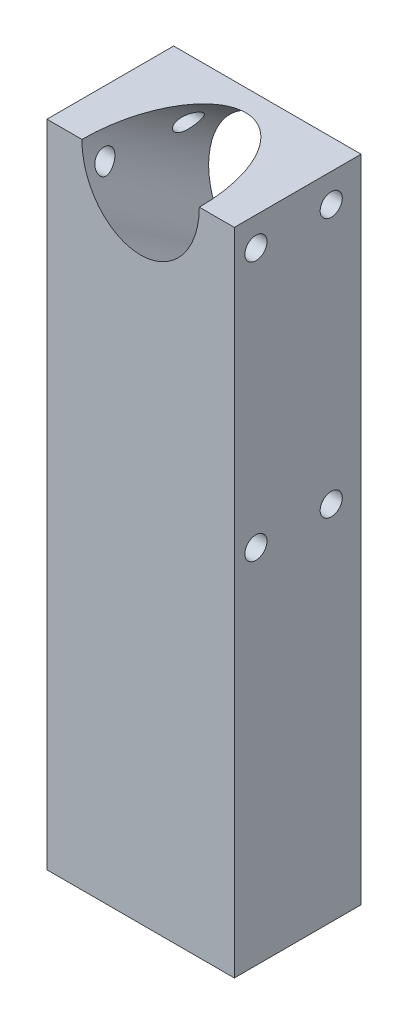
ISO-10303-21;
HEADER;
FILE_DESCRIPTION(('STEP AP214'),'2;1');
FILE_NAME('part.step','',(''),(''),'','','');
FILE_SCHEMA(('AUTOMOTIVE_DESIGN { 1 0 10303 214 1 1 1 1 }'));
ENDSEC;
DATA;
#1=APPLICATION_CONTEXT('core data for automotive mechanical design processes');
#2=APPLICATION_PROTOCOL_DEFINITION('international standard','automotive_design',2000,#1);
#3=PRODUCT_CONTEXT('',#1,'mechanical');
#4=PRODUCT('Part','Part','',(#3));
#5=PRODUCT_RELATED_PRODUCT_CATEGORY('part','',(#4));
#6=PRODUCT_DEFINITION_FORMATION('','',#4);
#7=PRODUCT_DEFINITION_CONTEXT('part definition',#1,'design');
#8=PRODUCT_DEFINITION('design','',#6,#7);
#9=PRODUCT_DEFINITION_SHAPE('','',#8);
#10=(LENGTH_UNIT() NAMED_UNIT(*) SI_UNIT(.MILLI.,.METRE.));
#11=(NAMED_UNIT(*) PLANE_ANGLE_UNIT() SI_UNIT($,.RADIAN.));
#12=(NAMED_UNIT(*) SI_UNIT($,.STERADIAN.) SOLID_ANGLE_UNIT());
#13=UNCERTAINTY_MEASURE_WITH_UNIT(LENGTH_MEASURE(1.E-05),#10,'distance_accuracy_value','');
#14=(GEOMETRIC_REPRESENTATION_CONTEXT(3) GLOBAL_UNCERTAINTY_ASSIGNED_CONTEXT((#13)) GLOBAL_UNIT_ASSIGNED_CONTEXT((#10,
#11,#12)) REPRESENTATION_CONTEXT('',''));
#15=CARTESIAN_POINT('',(0.,0.,0.));
#16=DIRECTION('',(0.,0.,1.));
#17=DIRECTION('',(1.,0.,0.));
#18=AXIS2_PLACEMENT_3D('',#15,#16,#17);
#19=CARTESIAN_POINT('',(4668.57723500689,-4158.71386991855,60.0243600791614));
#20=DIRECTION('',(-1.,0.,0.));
#21=DIRECTION('',(0.,-1.,0.));
#22=AXIS2_PLACEMENT_3D('',#19,#20,#21);
#23=CYLINDRICAL_SURFACE('',#22,1.50000000000003);
#24=CARTESIAN_POINT('',(4663.29315786128,-4160.21386991855,60.0243600791614));
#25=CARTESIAN_POINT('',(4663.31028719174,-4160.21387411275,60.1031487408246));
#26=CARTESIAN_POINT('',(4663.32506304882,-4160.20764481529,60.1824299364788));
#27=CARTESIAN_POINT('',(4663.34994490399,-4160.1825056904,60.3397065651558));
#28=CARTESIAN_POINT('',(4663.36005215826,-4160.16359927738,60.4177023385958));
#29=CARTESIAN_POINT('',(4663.3756656756,-4160.11335856765,60.5701433442805));
#30=CARTESIAN_POINT('',(4663.38116808386,-4160.0820138909,60.6445855527068));
#31=CARTESIAN_POINT('',(4663.38761349707,-4160.00767086502,60.7876262930087));
#32=CARTESIAN_POINT('',(4663.38855634154,-4159.96467210581,60.8562246191355));
#33=CARTESIAN_POINT('',(4663.38590779636,-4159.86880069808,60.9848263402098));
#34=CARTESIAN_POINT('',(4663.3823674096,-4159.81604484214,61.0449179212571));
#35=CARTESIAN_POINT('',(4663.37080248677,-4159.70192698736,61.1557618598083));
#36=CARTESIAN_POINT('',(4663.36277819203,-4159.64056545181,61.206514719733));
#37=CARTESIAN_POINT('',(4663.34216400121,-4159.51100360017,61.2974880819213));
#38=CARTESIAN_POINT('',(4663.32956582958,-4159.44279105135,61.3376892643287));
#39=CARTESIAN_POINT('',(4663.29976307705,-4159.30173704484,61.4065955251621));
#40=CARTESIAN_POINT('',(4663.28255834742,-4159.22889543775,61.4353002323326));
#41=CARTESIAN_POINT('',(4663.24314168455,-4159.07916486318,61.4813527591177));
#42=CARTESIAN_POINT('',(4663.22082849323,-4159.00222222398,61.498438534985));
#43=CARTESIAN_POINT('',(4663.17157264678,-4158.84809311233,61.5203708390608));
#44=CARTESIAN_POINT('',(4663.1446292026,-4158.77090660053,61.5252152789964));
#45=CARTESIAN_POINT('',(4663.08484892696,-4158.61427621958,61.5232057777095));
#46=CARTESIAN_POINT('',(4663.05177402552,-4158.534932295,61.5157125427155));
#47=CARTESIAN_POINT('',(4662.98131939799,-4158.38027545587,61.4889018740488));
#48=CARTESIAN_POINT('',(4662.94393810354,-4158.30496402464,61.4695801213933));
#49=CARTESIAN_POINT('',(4662.86172026783,-4158.15293012498,61.4180577031873));
#50=CARTESIAN_POINT('',(4662.81651246515,-4158.07676936152,61.3847965609525));
#51=CARTESIAN_POINT('',(4662.72261245592,-4157.93256788157,61.3074315111849));
#52=CARTESIAN_POINT('',(4662.67391886747,-4157.86453041432,61.2633232863856));
#53=CARTESIAN_POINT('',(4662.56746323326,-4157.7291555105,61.159498123354));
#54=CARTESIAN_POINT('',(4662.50934997602,-4157.66308300564,61.0984921573808));
#55=CARTESIAN_POINT('',(4662.39138076285,-4157.54338309913,60.9666463676426));
#56=CARTESIAN_POINT('',(4662.33152304497,-4157.48976880824,60.8957963083006));
#57=CARTESIAN_POINT('',(4662.20453069413,-4157.39014195012,60.736805704533));
#58=CARTESIAN_POINT('',(4662.13738589635,-4157.34581684875,60.647610499545));
#59=CARTESIAN_POINT('',(4662.00580643409,-4157.27518455155,60.4604582094007));
#60=CARTESIAN_POINT('',(4661.94137007927,-4157.24886595634,60.3625067120848));
#61=CARTESIAN_POINT('',(4661.83547742169,-4157.22075291915,60.1864881494571));
#62=CARTESIAN_POINT('',(4661.79247749999,-4157.21428817456,60.110090411247));
#63=CARTESIAN_POINT('',(4661.71228150217,-4157.21349228001,59.954242785364));
#64=CARTESIAN_POINT('',(4661.67507523506,-4157.21913956049,59.8747985704455));
#65=CARTESIAN_POINT('',(4661.61664024925,-4157.24125032114,59.7321552281871));
#66=CARTESIAN_POINT('',(4661.59369783937,-4157.25504328039,59.6692522049973));
#67=CARTESIAN_POINT('',(4661.55472513965,-4157.29143048025,59.5438210092993));
#68=CARTESIAN_POINT('',(4661.53868893202,-4157.31401715396,59.4812925613175));
#69=CARTESIAN_POINT('',(4661.51495547664,-4157.36831614317,59.357988432765));
#70=CARTESIAN_POINT('',(4661.5073241424,-4157.40009815622,59.2972301943452));
#71=CARTESIAN_POINT('',(4661.50154316927,-4157.47195713271,59.1803513650359));
#72=CARTESIAN_POINT('',(4661.50338885288,-4157.51202999473,59.1242285001956));
#73=CARTESIAN_POINT('',(4661.51553129282,-4157.59364583059,59.0249963358927));
#74=CARTESIAN_POINT('',(4661.52479122837,-4157.63444017873,58.9811333893438));
#75=CARTESIAN_POINT('',(4661.54963656994,-4157.71990021469,58.8994044078222));
#76=CARTESIAN_POINT('',(4661.56522498592,-4157.76456773672,58.8615412384087));
#77=CARTESIAN_POINT('',(4661.60770951554,-4157.87192866372,58.780559803507));
#78=CARTESIAN_POINT('',(4661.63664292496,-4157.93566622948,58.7398992536019));
#79=CARTESIAN_POINT('',(4661.70120056098,-4158.06577408931,58.6695653698272));
#80=CARTESIAN_POINT('',(4661.73683875451,-4158.1321496468,58.639915362846));
#81=CARTESIAN_POINT('',(4661.82517205423,-4158.28828176302,58.5828736903555));
#82=CARTESIAN_POINT('',(4661.87960900457,-4158.37850702956,58.5594761369551));
#83=CARTESIAN_POINT('',(4661.99274345251,-4158.55900004624,58.529569738906));
#84=CARTESIAN_POINT('',(4662.05144437147,-4158.64926777143,58.523074613955));
#85=CARTESIAN_POINT('',(4662.17166100098,-4158.83005841277,58.526088688372));
#86=CARTESIAN_POINT('',(4662.23320879251,-4158.92055467809,58.5358986953132));
#87=CARTESIAN_POINT('',(4662.35600275905,-4159.09850281149,58.5716748440403));
#88=CARTESIAN_POINT('',(4662.41724891198,-4159.1859544595,58.5976421511628));
#89=CARTESIAN_POINT('',(4662.54473619966,-4159.36584852002,58.6696046475364));
#90=CARTESIAN_POINT('',(4662.61073017798,-4159.45768905166,58.7175773641827));
#91=CARTESIAN_POINT('',(4662.73794748217,-4159.63176059932,58.8333997125395));
#92=CARTESIAN_POINT('',(4662.79917177044,-4159.71399355555,58.9012453212524));
#93=CARTESIAN_POINT('',(4662.91004170144,-4159.85828375575,59.0496102490833));
#94=CARTESIAN_POINT('',(4662.96022377864,-4159.92143676594,59.1286541805647));
#95=CARTESIAN_POINT('',(4663.05328065769,-4160.03183087088,59.3008966136189));
#96=CARTESIAN_POINT('',(4663.09616517179,-4160.07909319751,59.3940759848536));
#97=CARTESIAN_POINT('',(4663.16740503331,-4160.14790799509,59.5755660604496));
#98=CARTESIAN_POINT('',(4663.1969859533,-4160.17234877649,59.6623061136876));
#99=CARTESIAN_POINT('',(4663.24983489824,-4160.20532022762,59.8405954407421));
#100=CARTESIAN_POINT('',(4663.27310850695,-4160.21386500936,59.9321403746036));
#101=CARTESIAN_POINT('',(4663.29315786128,-4160.21386991855,60.0243600791614));
#102=B_SPLINE_CURVE_WITH_KNOTS('',3,(#24,#25,#26,#27,#28,#29,#30,#31,#32,#33,#34,#35,#36,#37,
#38,#39,#40,#41,#42,#43,#44,#45,#46,#47,#48,#49,#50,#51,#52,#53,#54,#55,#56,#57,#58,#59,#60,#61,
#62,#63,#64,#65,#66,#67,#68,#69,#70,#71,#72,#73,#74,#75,#76,#77,#78,#79,#80,#81,#82,#83,#84,#85,
#86,#87,#88,#89,#90,#91,#92,#93,#94,#95,#96,#97,#98,#99,#100,#101),.UNSPECIFIED.,.T.,.F.,(4,2,2,
2,2,2,2,2,2,2,2,2,2,2,2,2,2,2,2,2,2,2,2,2,2,2,2,2,2,2,2,2,2,2,2,2,2,2,4),(0.,0.241569452500045,
0.483073867626929,0.724780249661558,0.966495138069742,1.20548473034888,1.44446146128622,
1.68387274748376,1.92329176436355,2.16794572181017,2.41264141242336,2.67041959711651,
2.92829196133203,3.21098114093499,3.49378301677459,3.81371788807291,4.13398794224667,
4.49274065802378,4.85126604764086,5.11411376617653,5.37649378422738,5.58080264594752,
5.78493608925321,5.9906592537358,6.19628089074422,6.37731777505938,6.55844086563602,
6.79996002247902,7.04198798040022,7.36410636360063,7.68648612879252,8.01487962144012,
8.34329680203968,8.70989740749398,9.07642385085305,9.41320464886638,9.74953366169454,
10.0325346341052,10.3152842464159),.UNSPECIFIED.);
#103=CARTESIAN_POINT('',(4663.29315786128,-4160.21386991855,60.0243600791614));
#104=VERTEX_POINT('',#103);
#105=EDGE_CURVE('E96',#104,#104,#102,.T.);
#106=ORIENTED_EDGE('',*,*,#105,.T.);
#107=EDGE_LOOP('',(#106));
#108=FACE_BOUND('',#107,.T.);
#109=CARTESIAN_POINT('',(4668.57723500689,-4158.71386991855,60.0243600791614));
#110=DIRECTION('',(-1.,0.,0.));
#111=DIRECTION('',(0.,-1.,0.));
#112=AXIS2_PLACEMENT_3D('',#109,#110,#111);
#113=CIRCLE('',#112,1.50000000000003);
#114=CARTESIAN_POINT('',(4668.57723500689,-4160.21386991855,60.0243600791614));
#115=VERTEX_POINT('',#114);
#116=EDGE_CURVE('E205',#115,#115,#113,.T.);
#117=ORIENTED_EDGE('',*,*,#116,.F.);
#118=EDGE_LOOP('',(#117));
#119=FACE_BOUND('',#118,.T.);
#120=ADVANCED_FACE('F37',(#108,#119),#23,.F.);
#121=CARTESIAN_POINT('',(4668.57723500689,-4158.71386991855,70.2295511072476));
#122=DIRECTION('',(-1.,0.,0.));
#123=DIRECTION('',(0.,-1.,0.));
#124=AXIS2_PLACEMENT_3D('',#121,#122,#123);
#125=CYLINDRICAL_SURFACE('',#124,1.50000000000018);
#126=CARTESIAN_POINT('',(4663.31582890784,-4160.21386991855,70.2295511072476));
#127=CARTESIAN_POINT('',(4663.29897266305,-4160.21386887635,70.3089602902174));
#128=CARTESIAN_POINT('',(4663.28357963159,-4160.20755218165,70.3886987717001));
#129=CARTESIAN_POINT('',(4663.25679198467,-4160.18211709359,70.5468213301461));
#130=CARTESIAN_POINT('',(4663.24539745555,-4160.16299842386,70.6252053778328));
#131=CARTESIAN_POINT('',(4663.22748375802,-4160.11212116538,70.7785812121746));
#132=CARTESIAN_POINT('',(4663.22097621388,-4160.08033271297,70.8535645145697));
#133=CARTESIAN_POINT('',(4663.21344988861,-4160.00488345221,70.9975935778545));
#134=CARTESIAN_POINT('',(4663.2124298045,-4159.9612254648,71.0666407444218));
#135=CARTESIAN_POINT('',(4663.21589973715,-4159.86517634982,71.1942465345016));
#136=CARTESIAN_POINT('',(4663.22018871885,-4159.81316494462,71.2530972763099));
#137=CARTESIAN_POINT('',(4663.23358326394,-4159.70093900387,71.3617147505162));
#138=CARTESIAN_POINT('',(4663.24268916789,-4159.64072388853,71.4114808402707));
#139=CARTESIAN_POINT('',(4663.26511493417,-4159.51330702239,71.501173820485));
#140=CARTESIAN_POINT('',(4663.2784701894,-4159.44604989484,71.5410128707813));
#141=CARTESIAN_POINT('',(4663.30843888191,-4159.30677749814,71.6095839046558));
#142=CARTESIAN_POINT('',(4663.3250531754,-4159.23476098193,71.6383129635785));
#143=CARTESIAN_POINT('',(4663.36165914894,-4159.0829774076,71.6857371882641));
#144=CARTESIAN_POINT('',(4663.38179880012,-4159.00300914353,71.7036739275888));
#145=CARTESIAN_POINT('',(4663.42340476494,-4158.84155421446,71.7263301963387));
#146=CARTESIAN_POINT('',(4663.44487151723,-4158.7600670537,71.7310453314181));
#147=CARTESIAN_POINT('',(4663.4892666937,-4158.59264459349,71.7271222974521));
#148=CARTESIAN_POINT('',(4663.51220672053,-4158.50673007753,71.7176810375404));
#149=CARTESIAN_POINT('',(4663.55709001462,-4158.33753307783,71.6841333548829));
#150=CARTESIAN_POINT('',(4663.57903320099,-4158.25425080785,71.6600257443661));
#151=CARTESIAN_POINT('',(4663.62106768523,-4158.09200903868,71.5973619145579));
#152=CARTESIAN_POINT('',(4663.64114345464,-4158.0130876805,71.5586960766278));
#153=CARTESIAN_POINT('',(4663.67845387479,-4157.86273216349,71.4678064450524));
#154=CARTESIAN_POINT('',(4663.69568913017,-4157.79129641244,71.4155855428675));
#155=CARTESIAN_POINT('',(4663.7263219255,-4157.66054127453,71.3009088229385));
#156=CARTESIAN_POINT('',(4663.73982820058,-4157.60089748702,71.238851996271));
#157=CARTESIAN_POINT('',(4663.76361943188,-4157.49286846675,71.10507538609));
#158=CARTESIAN_POINT('',(4663.77390496105,-4157.44448123193,71.033357324492));
#159=CARTESIAN_POINT('',(4663.7911694451,-4157.36192134755,70.8847163936895));
#160=CARTESIAN_POINT('',(4663.79824018931,-4157.32735803451,70.8080208032795));
#161=CARTESIAN_POINT('',(4663.80992250689,-4157.27149088297,70.6497686320246));
#162=CARTESIAN_POINT('',(4663.81453417752,-4157.25018652005,70.568212243577));
#163=CARTESIAN_POINT('',(4663.82180858714,-4157.22161629352,70.403175661094));
#164=CARTESIAN_POINT('',(4663.82448448275,-4157.21425509936,70.3197125088013));
#165=CARTESIAN_POINT('',(4663.82851166715,-4157.2135142314,70.1526923804775));
#166=CARTESIAN_POINT('',(4663.82986292366,-4157.22013489822,70.0691354022102));
#167=CARTESIAN_POINT('',(4663.83177530751,-4157.2472567889,69.9038196687059));
#168=CARTESIAN_POINT('',(4663.83233201131,-4157.2678347893,69.8220734561945));
#169=CARTESIAN_POINT('',(4663.83305545434,-4157.32237070132,69.663171051767));
#170=CARTESIAN_POINT('',(4663.8332221868,-4157.35632884543,69.5860149396334));
#171=CARTESIAN_POINT('',(4663.8333966496,-4157.43681199519,69.438204626434));
#172=CARTESIAN_POINT('',(4663.83340381403,-4157.48338113425,69.3675744503474));
#173=CARTESIAN_POINT('',(4663.83327183623,-4157.5877114663,69.2351296919371));
#174=CARTESIAN_POINT('',(4663.83313269231,-4157.64547278892,69.1733152117239));
#175=CARTESIAN_POINT('',(4663.83250062618,-4157.77057461585,69.060232339569));
#176=CARTESIAN_POINT('',(4663.83200755685,-4157.83791909477,69.0089683451162));
#177=CARTESIAN_POINT('',(4663.83026771739,-4157.98025265421,68.9184761970757));
#178=CARTESIAN_POINT('',(4663.82902094653,-4158.05524174235,68.8792480554772));
#179=CARTESIAN_POINT('',(4663.82524161168,-4158.21062585976,68.8139812552972));
#180=CARTESIAN_POINT('',(4663.82271052407,-4158.29101459003,68.7879275206013));
#181=CARTESIAN_POINT('',(4663.81577663449,-4158.45494469187,68.7496724647901));
#182=CARTESIAN_POINT('',(4663.81137392908,-4158.53848590059,68.7374704290415));
#183=CARTESIAN_POINT('',(4663.80017901499,-4158.70583571312,68.7272440439995));
#184=CARTESIAN_POINT('',(4663.79339932965,-4158.78964067737,68.729146422482));
#185=CARTESIAN_POINT('',(4663.77704097871,-4158.95549644337,68.7467932144103));
#186=CARTESIAN_POINT('',(4663.76746246317,-4159.03754733892,68.7625368858323));
#187=CARTESIAN_POINT('',(4663.74534809116,-4159.19728224142,68.8071698538182));
#188=CARTESIAN_POINT('',(4663.7328216563,-4159.27497920387,68.8360175374805));
#189=CARTESIAN_POINT('',(4663.70486162669,-4159.42415626021,68.9058152461292));
#190=CARTESIAN_POINT('',(4663.68942790349,-4159.4956360792,68.9467658059218));
#191=CARTESIAN_POINT('',(4663.65573391097,-4159.6315644439,69.0401238557036));
#192=CARTESIAN_POINT('',(4663.63743475831,-4159.6958916016,69.0926938028603));
#193=CARTESIAN_POINT('',(4663.59878058259,-4159.8147266998,69.2073305285199));
#194=CARTESIAN_POINT('',(4663.57842493687,-4159.86923165236,69.2694001862703));
#195=CARTESIAN_POINT('',(4663.53572980572,-4159.96893351534,69.4036845884499));
#196=CARTESIAN_POINT('',(4663.51334555872,-4160.01373158234,69.4761811373604));
#197=CARTESIAN_POINT('',(4663.46834822943,-4160.09041769962,69.6276231451126));
#198=CARTESIAN_POINT('',(4663.44573520894,-4160.12230914563,69.7065669011144));
#199=CARTESIAN_POINT('',(4663.40427576523,-4160.16925013585,69.8588640111056));
#200=CARTESIAN_POINT('',(4663.38531004223,-4160.18589800619,69.931696276527));
#201=CARTESIAN_POINT('',(4663.34906860261,-4160.20820738666,70.0794378693634));
#202=CARTESIAN_POINT('',(4663.33179257754,-4160.21387090556,70.1543468144609));
#203=CARTESIAN_POINT('',(4663.31582890784,-4160.21386991855,70.2295511072476));
#204=B_SPLINE_CURVE_WITH_KNOTS('',3,(#126,#127,#128,#129,#130,#131,#132,#133,#134,#135,#136,
#137,#138,#139,#140,#141,#142,#143,#144,#145,#146,#147,#148,#149,#150,#151,#152,#153,#154,#155,
#156,#157,#158,#159,#160,#161,#162,#163,#164,#165,#166,#167,#168,#169,#170,#171,#172,#173,#174,
#175,#176,#177,#178,#179,#180,#181,#182,#183,#184,#185,#186,#187,#188,#189,#190,#191,#192,#193,
#194,#195,#196,#197,#198,#199,#200,#201,#202,#203),.UNSPECIFIED.,.T.,.F.,(4,2,2,2,2,2,2,2,2,2,2,
2,2,2,2,2,2,2,2,2,2,2,2,2,2,2,2,2,2,2,2,2,2,2,2,2,2,2,4),(0.,0.243287299965945,0.48657985209316,
0.730449287195625,0.974260814007865,1.20911601119766,1.44398781548621,1.68086946503761,
1.91781343024405,2.16989731756686,2.42206497781985,2.68908936459405,2.95613537951956,
3.22523373520511,3.4942747360403,3.75435154819978,4.01438206821859,4.26643242153284,
4.51847280495035,4.76878365914063,5.01910061154974,5.27080579656652,5.52251535530674,
5.77511744160564,6.02772245351135,6.28043254001487,6.53314287824732,6.78556336956202,
7.0379708374721,7.28906797458252,7.54015165133963,7.79044350522353,8.0407464207442,
8.2947994042752,8.54892954123896,8.81207586033833,9.07515290047785,9.3055997522212,
9.53600445673619),.UNSPECIFIED.);
#205=CARTESIAN_POINT('',(4663.31582890784,-4160.21386991855,70.2295511072476));
#206=VERTEX_POINT('',#205);
#207=EDGE_CURVE('E41',#206,#206,#204,.T.);
#208=ORIENTED_EDGE('',*,*,#207,.T.);
#209=EDGE_LOOP('',(#208));
#210=FACE_BOUND('',#209,.T.);
#211=CARTESIAN_POINT('',(4668.57723500689,-4158.71386991855,70.2295511072476));
#212=DIRECTION('',(-1.,0.,0.));
#213=DIRECTION('',(0.,-1.,0.));
#214=AXIS2_PLACEMENT_3D('',#211,#212,#213);
#215=CIRCLE('',#214,1.50000000000018);
#216=CARTESIAN_POINT('',(4668.57723500689,-4160.21386991855,70.2295511072476));
#217=VERTEX_POINT('',#216);
#218=EDGE_CURVE('E213',#217,#217,#215,.T.);
#219=ORIENTED_EDGE('',*,*,#218,.F.);
#220=EDGE_LOOP('',(#219));
#221=FACE_BOUND('',#220,.T.);
#222=ADVANCED_FACE('F173',(#210,#221),#125,.F.);
#223=CARTESIAN_POINT('',(4685.67168100906,-4193.87686785341,60.0243600791614));
#224=DIRECTION('',(-1.,0.,0.));
#225=DIRECTION('',(0.,-1.,0.));
#226=AXIS2_PLACEMENT_3D('',#223,#224,#225);
#227=CYLINDRICAL_SURFACE('',#226,1.50000000000002);
#228=CARTESIAN_POINT('',(4668.57723500689,-4193.87686785341,60.0243600791614));
#229=DIRECTION('',(-1.,0.,0.));
#230=DIRECTION('',(0.,-1.,0.));
#231=AXIS2_PLACEMENT_3D('',#228,#229,#230);
#232=CIRCLE('',#231,1.50000000000002);
#233=CARTESIAN_POINT('',(4668.57723500689,-4195.37686785341,60.0243600791614));
#234=VERTEX_POINT('',#233);
#235=EDGE_CURVE('E119',#234,#234,#232,.T.);
#236=ORIENTED_EDGE('',*,*,#235,.F.);
#237=EDGE_LOOP('',(#236));
#238=FACE_BOUND('',#237,.T.);
#239=CARTESIAN_POINT('',(4643.17723500689,-4193.87686785341,60.0243600791614));
#240=DIRECTION('',(1.,0.,0.));
#241=DIRECTION('',(0.,1.,0.));
#242=AXIS2_PLACEMENT_3D('',#239,#240,#241);
#243=CIRCLE('',#242,1.50000000000008);
#244=CARTESIAN_POINT('',(4643.17723500689,-4192.37686785341,60.0243600791614));
#245=VERTEX_POINT('',#244);
#246=EDGE_CURVE('E132',#245,#245,#243,.T.);
#247=ORIENTED_EDGE('',*,*,#246,.F.);
#248=EDGE_LOOP('',(#247));
#249=FACE_BOUND('',#248,.T.);
#250=ADVANCED_FACE('F169',(#238,#249),#227,.F.);
#251=CARTESIAN_POINT('',(4685.67168100906,-4193.87686785341,70.2295511072476));
#252=DIRECTION('',(-1.,0.,0.));
#253=DIRECTION('',(0.,-1.,0.));
#254=AXIS2_PLACEMENT_3D('',#251,#252,#253);
#255=CYLINDRICAL_SURFACE('',#254,1.49999999999989);
#256=CARTESIAN_POINT('',(4668.57723500689,-4193.87686785341,70.2295511072476));
#257=DIRECTION('',(-1.,0.,0.));
#258=DIRECTION('',(0.,-1.,0.));
#259=AXIS2_PLACEMENT_3D('',#256,#257,#258);
#260=CIRCLE('',#259,1.49999999999989);
#261=CARTESIAN_POINT('',(4668.57723500689,-4195.37686785341,70.2295511072476));
#262=VERTEX_POINT('',#261);
#263=EDGE_CURVE('E126',#262,#262,#260,.T.);
#264=ORIENTED_EDGE('',*,*,#263,.F.);
#265=EDGE_LOOP('',(#264));
#266=FACE_BOUND('',#265,.T.);
#267=CARTESIAN_POINT('',(4643.17723500689,-4193.87686785341,70.2295511072476));
#268=DIRECTION('',(1.,0.,0.));
#269=DIRECTION('',(0.,1.,0.));
#270=AXIS2_PLACEMENT_3D('',#267,#268,#269);
#271=CIRCLE('',#270,1.49999999999993);
#272=CARTESIAN_POINT('',(4643.17723500689,-4192.37686785341,70.2295511072476));
#273=VERTEX_POINT('',#272);
#274=EDGE_CURVE('E129',#273,#273,#271,.T.);
#275=ORIENTED_EDGE('',*,*,#274,.F.);
#276=EDGE_LOOP('',(#275));
#277=FACE_BOUND('',#276,.T.);
#278=ADVANCED_FACE('F172',(#266,#277),#255,.F.);
#279=CARTESIAN_POINT('',(4594.68472853508,-4154.83236888598,27.7485333618744));
#280=DIRECTION('',(0.,-1.,0.));
#281=DIRECTION('',(0.,0.,1.));
#282=AXIS2_PLACEMENT_3D('',#279,#280,#281);
#283=PLANE('',#282);
#284=DIRECTION('',(-1.,0.,0.));
#285=VECTOR('',#284,1.);
#286=CARTESIAN_POINT('',(4668.57723500689,-4154.83236888598,73.1581251567649));
#287=LINE('',#286,#285);
#288=CARTESIAN_POINT('',(4647.92068500689,-4154.83236888598,73.1581251567649));
#289=VERTEX_POINT('',#288);
#290=CARTESIAN_POINT('',(4643.17723500689,-4154.83236888598,73.1581251567649));
#291=VERTEX_POINT('',#290);
#292=EDGE_CURVE('E103',#289,#291,#287,.T.);
#293=ORIENTED_EDGE('',*,*,#292,.F.);
#294=CARTESIAN_POINT('',(4655.87723500689,-4154.83236888598,73.1581251567642));
#295=DIRECTION('',(0.,-1.,0.));
#296=DIRECTION('',(0.,0.,1.));
#297=AXIS2_PLACEMENT_3D('',#294,#295,#296);
#298=ELLIPSE('',#297,14.2286319275809,7.95655000000049);
#299=CARTESIAN_POINT('',(4663.83378500689,-4154.83236888598,73.1581251567649));
#300=VERTEX_POINT('',#299);
#301=EDGE_CURVE('E58',#289,#300,#298,.T.);
#302=ORIENTED_EDGE('',*,*,#301,.T.);
#303=CARTESIAN_POINT('',(4668.57723500689,-4154.83236888598,73.1581251567649));
#304=VERTEX_POINT('',#303);
#305=EDGE_CURVE('E101',#304,#300,#287,.T.);
#306=ORIENTED_EDGE('',*,*,#305,.F.);
#307=DIRECTION('',(0.,0.,1.));
#308=VECTOR('',#307,1.);
#309=CARTESIAN_POINT('',(4668.57723500689,-4154.83236888598,55.9775327188838));
#310=LINE('',#309,#308);
#311=CARTESIAN_POINT('',(4668.57723500689,-4154.83236888598,55.9775327188837));
#312=VERTEX_POINT('',#311);
#313=EDGE_CURVE('E111',#312,#304,#310,.T.);
#314=ORIENTED_EDGE('',*,*,#313,.F.);
#315=DIRECTION('',(1.,0.,0.));
#316=VECTOR('',#315,1.);
#317=CARTESIAN_POINT('',(4668.57723500689,-4154.83236888598,55.9775327188838));
#318=LINE('',#317,#316);
#319=CARTESIAN_POINT('',(4643.17723500689,-4154.83236888598,55.9775327188837));
#320=VERTEX_POINT('',#319);
#321=EDGE_CURVE('E51',#320,#312,#318,.T.);
#322=ORIENTED_EDGE('',*,*,#321,.F.);
#323=DIRECTION('',(0.,0.,-1.));
#324=VECTOR('',#323,1.);
#325=CARTESIAN_POINT('',(4643.17723500689,-4154.83236888598,55.9775327188838));
#326=LINE('',#325,#324);
#327=EDGE_CURVE('E107',#291,#320,#326,.T.);
#328=ORIENTED_EDGE('',*,*,#327,.F.);
#329=EDGE_LOOP('',(#293,#302,#306,#314,#322,#328));
#330=FACE_BOUND('',#329,.T.);
#331=ADVANCED_FACE('F99',(#330),#283,.F.);
#332=CARTESIAN_POINT('',(4668.57723500689,-4124.1675232722,55.9775327188838));
#333=DIRECTION('',(-1.,0.,0.));
#334=DIRECTION('',(0.,-1.,0.));
#335=AXIS2_PLACEMENT_3D('',#332,#333,#334);
#336=PLANE('',#335);
#337=ORIENTED_EDGE('',*,*,#218,.T.);
#338=EDGE_LOOP('',(#337));
#339=FACE_BOUND('',#338,.T.);
#340=ORIENTED_EDGE('',*,*,#116,.T.);
#341=EDGE_LOOP('',(#340));
#342=FACE_BOUND('',#341,.T.);
#343=DIRECTION('',(0.,-1.,0.));
#344=VECTOR('',#343,1.);
#345=CARTESIAN_POINT('',(4668.57723500689,-4124.1675232722,73.1581251567649));
#346=LINE('',#345,#344);
#347=CARTESIAN_POINT('',(4668.57723500689,-4242.94201249301,73.1581251567649));
#348=VERTEX_POINT('',#347);
#349=EDGE_CURVE('E66',#304,#348,#346,.T.);
#350=ORIENTED_EDGE('',*,*,#349,.T.);
#351=DIRECTION('',(0.,0.,-1.));
#352=VECTOR('',#351,1.);
#353=CARTESIAN_POINT('',(4668.57723500689,-4242.94201249301,55.9775327188838));
#354=LINE('',#353,#352);
#355=CARTESIAN_POINT('',(4668.57723500689,-4242.94201249301,55.9775327188837));
#356=VERTEX_POINT('',#355);
#357=EDGE_CURVE('E207',#348,#356,#354,.T.);
#358=ORIENTED_EDGE('',*,*,#357,.T.);
#359=DIRECTION('',(0.,-1.,0.));
#360=VECTOR('',#359,1.);
#361=CARTESIAN_POINT('',(4668.57723500689,-4124.1675232722,55.9775327188838));
#362=LINE('',#361,#360);
#363=EDGE_CURVE('E117',#312,#356,#362,.T.);
#364=ORIENTED_EDGE('',*,*,#363,.F.);
#365=ORIENTED_EDGE('',*,*,#313,.T.);
#366=EDGE_LOOP('',(#350,#358,#364,#365));
#367=FACE_BOUND('',#366,.T.);
#368=ORIENTED_EDGE('',*,*,#235,.T.);
#369=EDGE_LOOP('',(#368));
#370=FACE_BOUND('',#369,.T.);
#371=ORIENTED_EDGE('',*,*,#263,.T.);
#372=EDGE_LOOP('',(#371));
#373=FACE_BOUND('',#372,.T.);
#374=ADVANCED_FACE('F180',(#339,#342,#367,#370,#373),#336,.F.);
#375=CARTESIAN_POINT('',(4643.17723500689,-4124.1675232722,55.9775327188838));
#376=DIRECTION('',(1.,0.,0.));
#377=DIRECTION('',(0.,1.,0.));
#378=AXIS2_PLACEMENT_3D('',#375,#376,#377);
#379=PLANE('',#378);
#380=CARTESIAN_POINT('',(4643.17723500689,-4158.71386991855,70.2295511072476));
#381=DIRECTION('',(-1.,0.,0.));
#382=DIRECTION('',(0.,-1.,0.));
#383=AXIS2_PLACEMENT_3D('',#380,#381,#382);
#384=CIRCLE('',#383,1.50000000000018);
#385=CARTESIAN_POINT('',(4643.17723500689,-4160.21386991855,70.2295511072476));
#386=VERTEX_POINT('',#385);
#387=EDGE_CURVE('E216',#386,#386,#384,.T.);
#388=ORIENTED_EDGE('',*,*,#387,.F.);
#389=EDGE_LOOP('',(#388));
#390=FACE_BOUND('',#389,.T.);
#391=CARTESIAN_POINT('',(4643.17723500689,-4158.71386991855,60.0243600791614));
#392=DIRECTION('',(-1.,0.,0.));
#393=DIRECTION('',(0.,-1.,0.));
#394=AXIS2_PLACEMENT_3D('',#391,#392,#393);
#395=CIRCLE('',#394,1.50000000000003);
#396=CARTESIAN_POINT('',(4643.17723500689,-4160.21386991855,60.0243600791614));
#397=VERTEX_POINT('',#396);
#398=EDGE_CURVE('E208',#397,#397,#395,.T.);
#399=ORIENTED_EDGE('',*,*,#398,.F.);
#400=EDGE_LOOP('',(#399));
#401=FACE_BOUND('',#400,.T.);
#402=DIRECTION('',(0.,-1.,0.));
#403=VECTOR('',#402,1.);
#404=CARTESIAN_POINT('',(4643.17723500689,-4124.1675232722,55.9775327188838));
#405=LINE('',#404,#403);
#406=CARTESIAN_POINT('',(4643.17723500689,-4242.94201249301,55.9775327188837));
#407=VERTEX_POINT('',#406);
#408=EDGE_CURVE('E123',#320,#407,#405,.T.);
#409=ORIENTED_EDGE('',*,*,#408,.T.);
#410=DIRECTION('',(0.,0.,1.));
#411=VECTOR('',#410,1.);
#412=CARTESIAN_POINT('',(4643.17723500689,-4242.94201249301,55.9775327188838));
#413=LINE('',#412,#411);
#414=CARTESIAN_POINT('',(4643.17723500689,-4242.94201249301,73.158125156767));
#415=VERTEX_POINT('',#414);
#416=EDGE_CURVE('E113',#407,#415,#413,.T.);
#417=ORIENTED_EDGE('',*,*,#416,.T.);
#418=DIRECTION('',(0.,-1.,0.));
#419=VECTOR('',#418,1.);
#420=CARTESIAN_POINT('',(4643.17723500689,-4124.1675232722,73.1581251567649));
#421=LINE('',#420,#419);
#422=EDGE_CURVE('E121',#291,#415,#421,.T.);
#423=ORIENTED_EDGE('',*,*,#422,.F.);
#424=ORIENTED_EDGE('',*,*,#327,.T.);
#425=EDGE_LOOP('',(#409,#417,#423,#424));
#426=FACE_BOUND('',#425,.T.);
#427=ORIENTED_EDGE('',*,*,#274,.T.);
#428=EDGE_LOOP('',(#427));
#429=FACE_BOUND('',#428,.T.);
#430=ORIENTED_EDGE('',*,*,#246,.T.);
#431=EDGE_LOOP('',(#430));
#432=FACE_BOUND('',#431,.T.);
#433=ADVANCED_FACE('F183',(#390,#401,#426,#429,#432),#379,.F.);
#434=CARTESIAN_POINT('',(4668.57723500689,-4124.1675232722,55.9775327188838));
#435=DIRECTION('',(0.,0.,1.));
#436=DIRECTION('',(0.,-1.,0.));
#437=AXIS2_PLACEMENT_3D('',#434,#435,#436);
#438=PLANE('',#437);
#439=CARTESIAN_POINT('',(4655.87723500689,-4166.42082480973,55.9775327188838));
#440=DIRECTION('',(0.,0.,1.));
#441=DIRECTION('',(0.,1.,0.));
#442=AXIS2_PLACEMENT_3D('',#439,#440,#441);
#443=ELLIPSE('',#442,9.59733341816932,7.95655000000049);
#444=CARTESIAN_POINT('',(4655.87723500689,-4156.82349139156,55.9775327188838));
#445=VERTEX_POINT('',#444);
#446=EDGE_CURVE('E104',#445,#445,#443,.T.);
#447=ORIENTED_EDGE('',*,*,#446,.T.);
#448=EDGE_LOOP('',(#447));
#449=FACE_BOUND('',#448,.T.);
#450=ORIENTED_EDGE('',*,*,#363,.T.);
#451=DIRECTION('',(-1.,0.,0.));
#452=VECTOR('',#451,1.);
#453=CARTESIAN_POINT('',(4668.57723500689,-4242.94201249301,55.9775327188837));
#454=LINE('',#453,#452);
#455=EDGE_CURVE('E210',#356,#407,#454,.T.);
#456=ORIENTED_EDGE('',*,*,#455,.T.);
#457=ORIENTED_EDGE('',*,*,#408,.F.);
#458=ORIENTED_EDGE('',*,*,#321,.T.);
#459=EDGE_LOOP('',(#450,#456,#457,#458));
#460=FACE_BOUND('',#459,.T.);
#461=ADVANCED_FACE('F39',(#449,#460),#438,.F.);
#462=CARTESIAN_POINT('',(4670.29229527073,-4242.94201249301,28.6478996226722));
#463=DIRECTION('',(0.,1.,0.));
#464=DIRECTION('',(0.,0.,1.));
#465=AXIS2_PLACEMENT_3D('',#462,#463,#464);
#466=PLANE('',#465);
#467=ORIENTED_EDGE('',*,*,#455,.F.);
#468=ORIENTED_EDGE('',*,*,#357,.F.);
#469=DIRECTION('',(1.,0.,0.));
#470=VECTOR('',#469,1.);
#471=CARTESIAN_POINT('',(4668.57723500689,-4242.94201249301,73.1581251567649));
#472=LINE('',#471,#470);
#473=EDGE_CURVE('E11',#415,#348,#472,.T.);
#474=ORIENTED_EDGE('',*,*,#473,.F.);
#475=ORIENTED_EDGE('',*,*,#416,.F.);
#476=EDGE_LOOP('',(#467,#468,#474,#475));
#477=FACE_BOUND('',#476,.T.);
#478=ADVANCED_FACE('F164',(#477),#466,.F.);
#479=CARTESIAN_POINT('',(4668.57723500689,-4124.1675232722,73.1581251567649));
#480=DIRECTION('',(0.,0.,-1.));
#481=DIRECTION('',(0.,1.,0.));
#482=AXIS2_PLACEMENT_3D('',#479,#480,#481);
#483=PLANE('',#482);
#484=ORIENTED_EDGE('',*,*,#305,.T.);
#485=CARTESIAN_POINT('',(4655.87723500689,-4154.83236888598,73.1581251567649));
#486=DIRECTION('',(0.,0.,-1.));
#487=DIRECTION('',(0.,1.,0.));
#488=AXIS2_PLACEMENT_3D('',#485,#486,#487);
#489=ELLIPSE('',#488,9.59733341816932,7.95655000000049);
#490=EDGE_CURVE('E90',#300,#289,#489,.T.);
#491=ORIENTED_EDGE('',*,*,#490,.T.);
#492=ORIENTED_EDGE('',*,*,#292,.T.);
#493=ORIENTED_EDGE('',*,*,#422,.T.);
#494=ORIENTED_EDGE('',*,*,#473,.T.);
#495=ORIENTED_EDGE('',*,*,#349,.F.);
#496=EDGE_LOOP('',(#484,#491,#492,#493,#494,#495));
#497=FACE_BOUND('',#496,.T.);
#498=ADVANCED_FACE('F106',(#497),#483,.F.);
#499=CARTESIAN_POINT('',(4648.4613121525,-4160.21386991855,60.0243600791614));
#500=CARTESIAN_POINT('',(4648.47971851487,-4160.21386577644,59.9396946042895));
#501=CARTESIAN_POINT('',(4648.50084425534,-4160.20666941611,59.8555809290774));
#502=CARTESIAN_POINT('',(4648.54843179117,-4160.17877556646,59.6911628383543));
#503=CARTESIAN_POINT('',(4648.57489842889,-4160.15806578675,59.6108619619534));
#504=CARTESIAN_POINT('',(4648.63278025841,-4160.10466966677,59.4566345038623));
#505=CARTESIAN_POINT('',(4648.6641780033,-4160.07202503235,59.3826868193088));
#506=CARTESIAN_POINT('',(4648.73152656005,-4159.99649324452,59.2425554737568));
#507=CARTESIAN_POINT('',(4648.76747739916,-4159.95360602979,59.1763718592464));
#508=CARTESIAN_POINT('',(4648.84594742173,-4159.85618556497,59.0486548411566));
#509=CARTESIAN_POINT('',(4648.88874799953,-4159.8010552607,58.9877518081712));
#510=CARTESIAN_POINT('',(4648.97803097261,-4159.6833229135,58.87688072397));
#511=CARTESIAN_POINT('',(4649.02451487795,-4159.62071780076,58.826917189503));
#512=CARTESIAN_POINT('',(4649.12638370607,-4159.48154129054,58.7326088676865));
#513=CARTESIAN_POINT('',(4649.18214686139,-4159.40420759175,58.6897988397603));
#514=CARTESIAN_POINT('',(4649.29585964561,-4159.24460148728,58.6186676943187));
#515=CARTESIAN_POINT('',(4649.35381110858,-4159.16232490314,58.5903590336435));
#516=CARTESIAN_POINT('',(4649.4779145466,-4158.98382248222,58.5456278743413));
#517=CARTESIAN_POINT('',(4649.54416425302,-4158.88716179801,58.5311976809452));
#518=CARTESIAN_POINT('',(4649.67514314075,-4158.69179275862,58.5213358829944));
#519=CARTESIAN_POINT('',(4649.73987238623,-4158.59308449016,58.5259034753226));
#520=CARTESIAN_POINT('',(4649.85219622545,-4158.41512974382,58.5522296710969));
#521=CARTESIAN_POINT('',(4649.90064835242,-4158.33589377155,58.5704110274048));
#522=CARTESIAN_POINT('',(4649.99208172055,-4158.17867636569,58.6206665424939));
#523=CARTESIAN_POINT('',(4650.03507238476,-4158.10069297979,58.6527163400623));
#524=CARTESIAN_POINT('',(4650.1028431689,-4157.96676868355,58.7220384259051));
#525=CARTESIAN_POINT('',(4650.12950211861,-4157.91012090086,58.756091172995));
#526=CARTESIAN_POINT('',(4650.17609608739,-4157.80005008034,58.8329629016566));
#527=CARTESIAN_POINT('',(4650.19603651994,-4157.74662447486,58.8757747805779));
#528=CARTESIAN_POINT('',(4650.22751305922,-4157.64434848323,58.9703149146557));
#529=CARTESIAN_POINT('',(4650.23896607384,-4157.5955473082,59.0221253489115));
#530=CARTESIAN_POINT('',(4650.25172656724,-4157.50537259124,59.1329451570362));
#531=CARTESIAN_POINT('',(4650.2530440445,-4157.46399176867,59.1919473779624));
#532=CARTESIAN_POINT('',(4650.24595711345,-4157.39576232487,59.3057882159527));
#533=CARTESIAN_POINT('',(4650.23893933562,-4157.36767531405,59.3599835630779));
#534=CARTESIAN_POINT('',(4650.21808163175,-4157.31866006225,59.470253281466));
#535=CARTESIAN_POINT('',(4650.20423838709,-4157.29773531204,59.5263285543948));
#536=CARTESIAN_POINT('',(4650.16635776796,-4157.25841978653,59.653918192995));
#537=CARTESIAN_POINT('',(4650.14058918228,-4157.24217909532,59.7255764361658));
#538=CARTESIAN_POINT('',(4650.08222512478,-4157.2203295681,59.8677272472911));
#539=CARTESIAN_POINT('',(4650.04961671199,-4157.21474109124,59.9382173283252));
#540=CARTESIAN_POINT('',(4649.96793176126,-4157.2129267681,60.1001164591728));
#541=CARTESIAN_POINT('',(4649.91699762049,-4157.22046393614,60.190623886125));
#542=CARTESIAN_POINT('',(4649.81035317801,-4157.25059491102,60.3660702375986));
#543=CARTESIAN_POINT('',(4649.75463836625,-4157.2732030749,60.4510037674495));
#544=CARTESIAN_POINT('',(4649.63975448661,-4157.33268243238,60.6161177151381));
#545=CARTESIAN_POINT('',(4649.58053704157,-4157.36984814419,60.6961577453925));
#546=CARTESIAN_POINT('',(4649.46179052364,-4157.45739701962,60.8483656937357));
#547=CARTESIAN_POINT('',(4649.40226143006,-4157.50778107185,60.9205330821241));
#548=CARTESIAN_POINT('',(4649.27557127706,-4157.62965469967,61.0658879567064));
#549=CARTESIAN_POINT('',(4649.2086226705,-4157.7031866598,61.1375688399182));
#550=CARTESIAN_POINT('',(4649.07874693785,-4157.86558677395,61.265773139213));
#551=CARTESIAN_POINT('',(4649.01582016537,-4157.95445627395,61.3222952238855));
#552=CARTESIAN_POINT('',(4648.89960272354,-4158.1399256647,61.413839129033));
#553=CARTESIAN_POINT('',(4648.84596535366,-4158.23578212912,61.4499145932151));
#554=CARTESIAN_POINT('',(4648.74586676343,-4158.43628935989,61.502073627479));
#555=CARTESIAN_POINT('',(4648.69939612698,-4158.54092830309,61.5181836287703));
#556=CARTESIAN_POINT('',(4648.6210380897,-4158.73912350919,61.5269381830899));
#557=CARTESIAN_POINT('',(4648.58801376407,-4158.83209689998,61.5226365548808));
#558=CARTESIAN_POINT('',(4648.52869801635,-4159.01767748095,61.4962497404697));
#559=CARTESIAN_POINT('',(4648.50240116772,-4159.11028490659,61.4741789472852));
#560=CARTESIAN_POINT('',(4648.45947263469,-4159.28040296787,61.4158182512744));
#561=CARTESIAN_POINT('',(4648.44206611628,-4159.35840457517,61.3815163398487));
#562=CARTESIAN_POINT('',(4648.41266275579,-4159.50820653574,61.2996265553152));
#563=CARTESIAN_POINT('',(4648.40066372004,-4159.58000939412,61.2520440825076));
#564=CARTESIAN_POINT('',(4648.38255187679,-4159.71082276072,61.1480399201832));
#565=CARTESIAN_POINT('',(4648.37613401089,-4159.77033762632,61.092303891303));
#566=CARTESIAN_POINT('',(4648.36795870062,-4159.87968349149,60.9717241615543));
#567=CARTESIAN_POINT('',(4648.36620100924,-4159.92951500419,60.9068809436027));
#568=CARTESIAN_POINT('',(4648.36731407399,-4160.01706917396,60.7713869291967));
#569=CARTESIAN_POINT('',(4648.37009186152,-4160.05501652006,60.7008802580765));
#570=CARTESIAN_POINT('',(4648.38013057758,-4160.11911859773,60.5550320847221));
#571=CARTESIAN_POINT('',(4648.38738876412,-4160.14528052499,60.4796935648094));
#572=CARTESIAN_POINT('',(4648.40464260515,-4160.18150788236,60.3408667353948));
#573=CARTESIAN_POINT('',(4648.41386480594,-4160.19367738742,60.2778202215935));
#574=CARTESIAN_POINT('',(4648.43532247709,-4160.20986015866,60.1511998122694));
#575=CARTESIAN_POINT('',(4648.4475580993,-4160.21387301371,60.0876258903256));
#576=CARTESIAN_POINT('',(4648.4613121525,-4160.21386991855,60.0243600791614));
#577=B_SPLINE_CURVE_WITH_KNOTS('',3,(#499,#500,#501,#502,#503,#504,#505,#506,#507,#508,#509,
#510,#511,#512,#513,#514,#515,#516,#517,#518,#519,#520,#521,#522,#523,#524,#525,#526,#527,#528,
#529,#530,#531,#532,#533,#534,#535,#536,#537,#538,#539,#540,#541,#542,#543,#544,#545,#546,#547,
#548,#549,#550,#551,#552,#553,#554,#555,#556,#557,#558,#559,#560,#561,#562,#563,#564,#565,#566,
#567,#568,#569,#570,#571,#572,#573,#574,#575,#576),.UNSPECIFIED.,.T.,.F.,(4,2,2,2,2,2,2,2,2,2,2,
2,2,2,2,2,2,2,2,2,2,2,2,2,2,2,2,2,2,2,2,2,2,2,2,2,2,2,4),(0.,0.259676782773381,
0.519590069944183,0.778603649138549,1.03761877912016,1.31440062432588,1.59129653384783,
1.90358933315136,2.21614994757012,2.56883371089268,2.92150256492408,3.20444769920841,
3.48689781882792,3.69992870278078,3.91278752295513,4.12770366246394,4.3424077646014,
4.52587270822162,4.70942694247592,4.94174606500454,5.17450876605505,5.48523571746069,
5.79625909950442,6.11393003059455,6.43162232259005,6.79751723405597,7.16344427187602,
7.50822660244209,7.85255200483898,8.1471325946739,8.44147481410673,8.70104189264601,
8.9605035763158,9.20468373595689,9.44885095261075,9.6880757491134,9.9271542860215,
10.1211865563666,10.3152286062994),.UNSPECIFIED.);
#578=CARTESIAN_POINT('',(4648.4613121525,-4160.21386991855,60.0243600791614));
#579=VERTEX_POINT('',#578);
#580=EDGE_CURVE('E151',#579,#579,#577,.T.);
#581=ORIENTED_EDGE('',*,*,#580,.T.);
#582=EDGE_LOOP('',(#581));
#583=FACE_BOUND('',#582,.T.);
#584=ORIENTED_EDGE('',*,*,#398,.T.);
#585=EDGE_LOOP('',(#584));
#586=FACE_BOUND('',#585,.T.);
#587=ADVANCED_FACE('F159',(#583,#586),#23,.F.);
#588=CARTESIAN_POINT('',(4648.43864110593,-4160.21386991855,70.2295511072476));
#589=CARTESIAN_POINT('',(4648.42018866882,-4160.21386660067,70.142628931482));
#590=CARTESIAN_POINT('',(4648.39996508161,-4160.20629347196,70.0560169679698));
#591=CARTESIAN_POINT('',(4648.35743018508,-4160.17651098337,69.8857911717188));
#592=CARTESIAN_POINT('',(4648.33511552959,-4160.15427780882,69.8021824510557));
#593=CARTESIAN_POINT('',(4648.28984442505,-4160.09595472531,69.6402905251239));
#594=CARTESIAN_POINT('',(4648.26688906929,-4160.05988722522,69.5619989472871));
#595=CARTESIAN_POINT('',(4648.22156665708,-4159.97483148566,69.412629908612));
#596=CARTESIAN_POINT('',(4648.19919939434,-4159.92584784494,69.3415498925698));
#597=CARTESIAN_POINT('',(4648.15583787341,-4159.81538778715,69.2076469729794));
#598=CARTESIAN_POINT('',(4648.13486580451,-4159.7537540413,69.1449463168985));
#599=CARTESIAN_POINT('',(4648.09552459905,-4159.6199909638,69.0309423974275));
#600=CARTESIAN_POINT('',(4648.0771551868,-4159.54786274545,68.9796379265357));
#601=CARTESIAN_POINT('',(4648.04410867359,-4159.39736974178,68.8915650118033));
#602=CARTESIAN_POINT('',(4648.02933975977,-4159.31924720935,68.8544173581017));
#603=CARTESIAN_POINT('',(4648.00306328604,-4159.15729993171,68.7939904153176));
#604=CARTESIAN_POINT('',(4647.9915550458,-4159.07347638056,68.7707082320622));
#605=CARTESIAN_POINT('',(4647.97205450557,-4158.90560837734,68.7394912607047));
#606=CARTESIAN_POINT('',(4647.96395631041,-4158.82166759408,68.731063303365));
#607=CARTESIAN_POINT('',(4647.95040195845,-4158.65335115881,68.7284114835456));
#608=CARTESIAN_POINT('',(4647.94494563693,-4158.56897553426,68.7341867353889));
#609=CARTESIAN_POINT('',(4647.93622265285,-4158.4032008594,68.759706757533));
#610=CARTESIAN_POINT('',(4647.93293273759,-4158.32177937061,68.7792983444965));
#611=CARTESIAN_POINT('',(4647.92788161142,-4158.16328269358,68.8317591694192));
#612=CARTESIAN_POINT('',(4647.92612043272,-4158.08620759689,68.8646286869186));
#613=CARTESIAN_POINT('',(4647.9235667596,-4157.93823593405,68.9429155644006));
#614=CARTESIAN_POINT('',(4647.92277885385,-4157.86737008815,68.9883911351425));
#615=CARTESIAN_POINT('',(4647.92172167356,-4157.7342270928,69.090542387971));
#616=CARTESIAN_POINT('',(4647.92145240934,-4157.67195011434,69.1472182929779));
#617=CARTESIAN_POINT('',(4647.92113102769,-4157.55748941606,69.2704442600394));
#618=CARTESIAN_POINT('',(4647.9210798564,-4157.50535060884,69.337036050905));
#619=CARTESIAN_POINT('',(4647.92110276198,-4157.41298261813,69.4780228353527));
#620=CARTESIAN_POINT('',(4647.92117684028,-4157.37275356895,69.5524179169187));
#621=CARTESIAN_POINT('',(4647.92158008453,-4157.30532128439,69.706958295236));
#622=CARTESIAN_POINT('',(4647.92190943518,-4157.27812750263,69.7871077169459));
#623=CARTESIAN_POINT('',(4647.92315960949,-4157.23758146856,69.9508313841908));
#624=CARTESIAN_POINT('',(4647.92408043689,-4157.22422930369,70.0344056513596));
#625=CARTESIAN_POINT('',(4647.92700681131,-4157.21174793107,70.2025332557223));
#626=CARTESIAN_POINT('',(4647.92901159282,-4157.21260869862,70.2870858608134));
#627=CARTESIAN_POINT('',(4647.93468368948,-4157.22848809305,70.4547942158073));
#628=CARTESIAN_POINT('',(4647.93835093554,-4157.24350613157,70.537950023615));
#629=CARTESIAN_POINT('',(4647.94789971253,-4157.28712163005,70.7000884943945));
#630=CARTESIAN_POINT('',(4647.95377127255,-4157.31565809128,70.7790881494564));
#631=CARTESIAN_POINT('',(4647.96819512583,-4157.3853692646,70.9310292707575));
#632=CARTESIAN_POINT('',(4647.97674724508,-4157.42654315639,71.0039711298163));
#633=CARTESIAN_POINT('',(4647.99676320284,-4157.5199764293,71.1414128547096));
#634=CARTESIAN_POINT('',(4648.00821332611,-4157.57218340777,71.2059503748285));
#635=CARTESIAN_POINT('',(4648.03407359688,-4157.68613980228,71.3252598239671));
#636=CARTESIAN_POINT('',(4648.04848385609,-4157.74788957839,71.380031384318));
#637=CARTESIAN_POINT('',(4648.08019818089,-4157.8797643911,71.4790065952726));
#638=CARTESIAN_POINT('',(4648.09753190553,-4157.9499729145,71.5230893290673));
#639=CARTESIAN_POINT('',(4648.13447451808,-4158.09619276544,71.5989535249758));
#640=CARTESIAN_POINT('',(4648.15408379958,-4158.17220509606,71.630732854857));
#641=CARTESIAN_POINT('',(4648.19551585053,-4158.33058161588,71.6822209624973));
#642=CARTESIAN_POINT('',(4648.21739020732,-4158.41307248845,71.7014983914402));
#643=CARTESIAN_POINT('',(4648.26177712333,-4158.57996205774,71.7259419628256));
#644=CARTESIAN_POINT('',(4648.2842898425,-4158.66436123156,71.7311045361352));
#645=CARTESIAN_POINT('',(4648.32947372056,-4158.83561750378,71.7271289496982));
#646=CARTESIAN_POINT('',(4648.35212791384,-4158.92246914509,71.7175396504472));
#647=CARTESIAN_POINT('',(4648.3954398772,-4159.09368729489,71.6832909507995));
#648=CARTESIAN_POINT('',(4648.41609759098,-4159.17805373322,71.6586311255034));
#649=CARTESIAN_POINT('',(4648.45366239553,-4159.34079091882,71.5950178652193));
#650=CARTESIAN_POINT('',(4648.47061545399,-4159.41922617838,71.5562576770673));
#651=CARTESIAN_POINT('',(4648.49970357073,-4159.56877743689,71.4651827186417));
#652=CARTESIAN_POINT('',(4648.51184141544,-4159.63989765113,71.4128758164883));
#653=CARTESIAN_POINT('',(4648.52956073443,-4159.76791419903,71.2999673081915));
#654=CARTESIAN_POINT('',(4648.53552064864,-4159.82543812987,71.2401366886663));
#655=CARTESIAN_POINT('',(4648.54170477339,-4159.92993707233,71.1116127749822));
#656=CARTESIAN_POINT('',(4648.54193007677,-4159.97691409218,71.0429211719742));
#657=CARTESIAN_POINT('',(4648.53677717731,-4160.05652803085,70.9029007926481));
#658=CARTESIAN_POINT('',(4648.53170776524,-4160.08981365102,70.8319271944249));
#659=CARTESIAN_POINT('',(4648.51685559088,-4160.1448042315,70.6861536082063));
#660=CARTESIAN_POINT('',(4648.50707680092,-4160.16651891932,70.6113568924202));
#661=CARTESIAN_POINT('',(4648.48746180128,-4160.19284641336,70.4851006208876));
#662=CARTESIAN_POINT('',(4648.47871915276,-4160.20074218155,70.4341240279387));
#663=CARTESIAN_POINT('',(4648.45973561173,-4160.21125486519,70.3319128810439));
#664=CARTESIAN_POINT('',(4648.44949474463,-4160.2138718701,70.2806783314847));
#665=CARTESIAN_POINT('',(4648.43864110593,-4160.21386991855,70.2295511072476));
#666=B_SPLINE_CURVE_WITH_KNOTS('',3,(#588,#589,#590,#591,#592,#593,#594,#595,#596,#597,#598,
#599,#600,#601,#602,#603,#604,#605,#606,#607,#608,#609,#610,#611,#612,#613,#614,#615,#616,#617,
#618,#619,#620,#621,#622,#623,#624,#625,#626,#627,#628,#629,#630,#631,#632,#633,#634,#635,#636,
#637,#638,#639,#640,#641,#642,#643,#644,#645,#646,#647,#648,#649,#650,#651,#652,#653,#654,#655,
#656,#657,#658,#659,#660,#661,#662,#663,#664,#665),.UNSPECIFIED.,.T.,.F.,(4,2,2,2,2,2,2,2,2,2,2,
2,2,2,2,2,2,2,2,2,2,2,2,2,2,2,2,2,2,2,2,2,2,2,2,2,2,2,4),(0.,0.26637919030466,0.533192172934707,
0.799574783994934,1.06586267818764,1.33568838365883,1.60548548564463,1.86743951203006,
2.12933884094257,2.38236646520678,2.63537831169513,2.88562821085881,3.13588337880567,
3.38731396877977,3.63874956348351,3.89127484761662,4.1438029793379,4.39651397718202,
4.64922657156888,4.90176092983791,5.15428479319864,5.40567989988687,5.65705869203049,
5.90726934334726,6.15748943821498,6.41042031610447,6.66339500839821,6.92468952025939,
7.18605009787909,7.45556389543196,7.72508529202859,7.99104405654557,8.25684869358895,
8.50518571928602,8.75347541888755,8.98805223907048,9.22243154131761,9.37911721217744,
9.53580022747063),.UNSPECIFIED.);
#667=CARTESIAN_POINT('',(4648.43864110593,-4160.21386991855,70.2295511072476));
#668=VERTEX_POINT('',#667);
#669=EDGE_CURVE('E136',#668,#668,#666,.T.);
#670=ORIENTED_EDGE('',*,*,#669,.T.);
#671=EDGE_LOOP('',(#670));
#672=FACE_BOUND('',#671,.T.);
#673=ORIENTED_EDGE('',*,*,#387,.T.);
#674=EDGE_LOOP('',(#673));
#675=FACE_BOUND('',#674,.T.);
#676=ADVANCED_FACE('F141',(#672,#675),#125,.F.);
#677=CARTESIAN_POINT('',(4655.87723500689,-4190.34874793028,20.5029278427753));
#678=DIRECTION('',(0.,0.559192903470745,0.829037572555043));
#679=DIRECTION('',(0.,-0.829037572555043,0.559192903470745));
#680=AXIS2_PLACEMENT_3D('',#677,#678,#679);
#681=CYLINDRICAL_SURFACE('',#680,7.95655000000049);
#682=ORIENTED_EDGE('',*,*,#490,.F.);
#683=ORIENTED_EDGE('',*,*,#301,.F.);
#684=EDGE_LOOP('',(#682,#683));
#685=FACE_BOUND('',#684,.T.);
#686=ORIENTED_EDGE('',*,*,#105,.F.);
#687=EDGE_LOOP('',(#686));
#688=FACE_BOUND('',#687,.T.);
#689=ORIENTED_EDGE('',*,*,#207,.F.);
#690=EDGE_LOOP('',(#689));
#691=FACE_BOUND('',#690,.T.);
#692=ORIENTED_EDGE('',*,*,#669,.F.);
#693=EDGE_LOOP('',(#692));
#694=FACE_BOUND('',#693,.T.);
#695=ORIENTED_EDGE('',*,*,#580,.F.);
#696=EDGE_LOOP('',(#695));
#697=FACE_BOUND('',#696,.T.);
#698=ORIENTED_EDGE('',*,*,#446,.F.);
#699=EDGE_LOOP('',(#698));
#700=FACE_BOUND('',#699,.T.);
#701=ADVANCED_FACE('F91',(#685,#688,#691,#694,#697,#700),#681,.F.);
#702=CLOSED_SHELL('',(#120,#222,#250,#278,#331,#374,#433,#461,#478,#498,#587,#676,#701));
#703=MANIFOLD_SOLID_BREP('B2',#702);
#704=ADVANCED_BREP_SHAPE_REPRESENTATION('',(#18,#703),#14);
#705=SHAPE_DEFINITION_REPRESENTATION(#9,#704);
ENDSEC;
END-ISO-10303-21;
